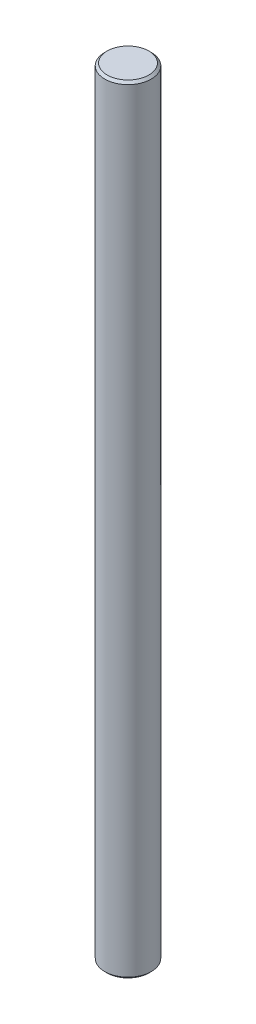
ISO-10303-21;
HEADER;
FILE_DESCRIPTION(('STEP AP214'),'2;1');
FILE_NAME('part.step','',(''),(''),'','','');
FILE_SCHEMA(('AUTOMOTIVE_DESIGN { 1 0 10303 214 1 1 1 1 }'));
ENDSEC;
DATA;
#1=APPLICATION_CONTEXT('core data for automotive mechanical design processes');
#2=APPLICATION_PROTOCOL_DEFINITION('international standard','automotive_design',2000,#1);
#3=PRODUCT_CONTEXT('',#1,'mechanical');
#4=PRODUCT('Part','Part','',(#3));
#5=PRODUCT_RELATED_PRODUCT_CATEGORY('part','',(#4));
#6=PRODUCT_DEFINITION_FORMATION('','',#4);
#7=PRODUCT_DEFINITION_CONTEXT('part definition',#1,'design');
#8=PRODUCT_DEFINITION('design','',#6,#7);
#9=PRODUCT_DEFINITION_SHAPE('','',#8);
#10=(LENGTH_UNIT() NAMED_UNIT(*) SI_UNIT(.MILLI.,.METRE.));
#11=(NAMED_UNIT(*) PLANE_ANGLE_UNIT() SI_UNIT($,.RADIAN.));
#12=(NAMED_UNIT(*) SI_UNIT($,.STERADIAN.) SOLID_ANGLE_UNIT());
#13=UNCERTAINTY_MEASURE_WITH_UNIT(LENGTH_MEASURE(1.E-05),#10,'distance_accuracy_value','');
#14=(GEOMETRIC_REPRESENTATION_CONTEXT(3) GLOBAL_UNCERTAINTY_ASSIGNED_CONTEXT((#13)) GLOBAL_UNIT_ASSIGNED_CONTEXT((#10,
#11,#12)) REPRESENTATION_CONTEXT('',''));
#15=CARTESIAN_POINT('',(0.,0.,0.));
#16=DIRECTION('',(0.,0.,1.));
#17=DIRECTION('',(1.,0.,0.));
#18=AXIS2_PLACEMENT_3D('',#15,#16,#17);
#19=CARTESIAN_POINT('',(0.,33.528,0.));
#20=DIRECTION('',(0.,1.,0.));
#21=DIRECTION('',(0.,0.,1.));
#22=AXIS2_PLACEMENT_3D('',#19,#20,#21);
#23=PLANE('',#22);
#24=CARTESIAN_POINT('',(0.,33.5279999999329,0.));
#25=DIRECTION('',(0.,-1.,0.));
#26=DIRECTION('',(0.,0.,-1.));
#27=AXIS2_PLACEMENT_3D('',#24,#25,#26);
#28=CIRCLE('',#27,0.898397999947065);
#29=CARTESIAN_POINT('',(0.,33.5279999999329,-0.898397999947065));
#30=VERTEX_POINT('',#29);
#31=EDGE_CURVE('E17',#30,#30,#28,.T.);
#32=ORIENTED_EDGE('',*,*,#31,.F.);
#33=EDGE_LOOP('',(#32));
#34=FACE_BOUND('',#33,.T.);
#35=ADVANCED_FACE('F14',(#34),#23,.T.);
#36=CARTESIAN_POINT('',(0.,0.,0.));
#37=DIRECTION('',(0.,1.,0.));
#38=DIRECTION('',(0.,0.,1.));
#39=AXIS2_PLACEMENT_3D('',#36,#37,#38);
#40=PLANE('',#39);
#41=CARTESIAN_POINT('',(0.,5.6843418860808E-11,0.));
#42=DIRECTION('',(0.,1.,0.));
#43=DIRECTION('',(-1.,0.,0.));
#44=AXIS2_PLACEMENT_3D('',#41,#42,#43);
#45=CIRCLE('',#44,0.898398000060752);
#46=CARTESIAN_POINT('',(-0.898398000060752,5.68434249486018E-11,0.));
#47=VERTEX_POINT('',#46);
#48=EDGE_CURVE('E26',#47,#47,#45,.T.);
#49=ORIENTED_EDGE('',*,*,#48,.F.);
#50=EDGE_LOOP('',(#49));
#51=FACE_BOUND('',#50,.T.);
#52=ADVANCED_FACE('F37',(#51),#40,.F.);
#53=CARTESIAN_POINT('',(0.,33.4263999999393,0.));
#54=DIRECTION('',(0.,-1.,0.));
#55=DIRECTION('',(0.,0.,-1.));
#56=AXIS2_PLACEMENT_3D('',#53,#54,#55);
#57=CONICAL_SURFACE('',#56,0.999997999940661,0.785398163397448);
#58=CARTESIAN_POINT('',(0.,33.4264,0.));
#59=DIRECTION('',(0.,-1.,0.));
#60=DIRECTION('',(0.,0.,-1.));
#61=AXIS2_PLACEMENT_3D('',#58,#59,#60);
#62=CIRCLE('',#61,0.999998);
#63=CARTESIAN_POINT('',(0.,33.4264,-0.999998));
#64=VERTEX_POINT('',#63);
#65=EDGE_CURVE('E21',#64,#64,#62,.T.);
#66=ORIENTED_EDGE('',*,*,#65,.F.);
#67=EDGE_LOOP('',(#66));
#68=FACE_BOUND('',#67,.T.);
#69=ORIENTED_EDGE('',*,*,#31,.T.);
#70=EDGE_LOOP('',(#69));
#71=FACE_BOUND('',#70,.T.);
#72=ADVANCED_FACE('F34',(#68,#71),#57,.T.);
#73=CARTESIAN_POINT('',(0.,0.101599999936752,0.));
#74=DIRECTION('',(0.,1.,0.));
#75=DIRECTION('',(-1.,0.,0.));
#76=AXIS2_PLACEMENT_3D('',#73,#74,#75);
#77=CONICAL_SURFACE('',#76,0.999997999883817,0.785398163117707);
#78=CARTESIAN_POINT('',(0.,0.1016,0.));
#79=DIRECTION('',(0.,-1.,0.));
#80=DIRECTION('',(0.,0.,-1.));
#81=AXIS2_PLACEMENT_3D('',#78,#79,#80);
#82=CIRCLE('',#81,0.999998);
#83=CARTESIAN_POINT('',(0.,0.1016,-0.999998));
#84=VERTEX_POINT('',#83);
#85=EDGE_CURVE('E10',#84,#84,#82,.F.);
#86=ORIENTED_EDGE('',*,*,#85,.F.);
#87=EDGE_LOOP('',(#86));
#88=FACE_BOUND('',#87,.T.);
#89=ORIENTED_EDGE('',*,*,#48,.T.);
#90=EDGE_LOOP('',(#89));
#91=FACE_BOUND('',#90,.T.);
#92=ADVANCED_FACE('F45',(#88,#91),#77,.T.);
#93=CARTESIAN_POINT('',(0.,33.528,0.));
#94=DIRECTION('',(0.,-1.,0.));
#95=DIRECTION('',(0.,0.,-1.));
#96=AXIS2_PLACEMENT_3D('',#93,#94,#95);
#97=CYLINDRICAL_SURFACE('',#96,0.999998);
#98=ORIENTED_EDGE('',*,*,#85,.T.);
#99=EDGE_LOOP('',(#98));
#100=FACE_BOUND('',#99,.T.);
#101=ORIENTED_EDGE('',*,*,#65,.T.);
#102=EDGE_LOOP('',(#101));
#103=FACE_BOUND('',#102,.T.);
#104=ADVANCED_FACE('F43',(#100,#103),#97,.T.);
#105=CLOSED_SHELL('',(#35,#52,#72,#92,#104));
#106=MANIFOLD_SOLID_BREP('B1',#105);
#107=ADVANCED_BREP_SHAPE_REPRESENTATION('',(#18,#106),#14);
#108=SHAPE_DEFINITION_REPRESENTATION(#9,#107);
ENDSEC;
END-ISO-10303-21;
